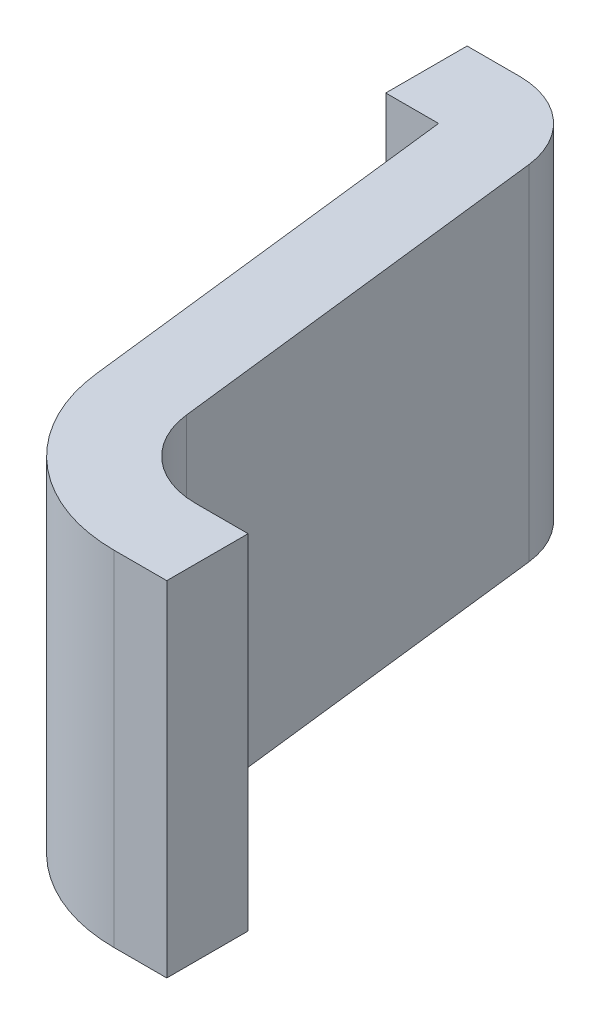
ISO-10303-21;
HEADER;
FILE_DESCRIPTION(('STEP AP214'),'2;1');
FILE_NAME('part.step','',(''),(''),'','','');
FILE_SCHEMA(('AUTOMOTIVE_DESIGN { 1 0 10303 214 1 1 1 1 }'));
ENDSEC;
DATA;
#1=APPLICATION_CONTEXT('core data for automotive mechanical design processes');
#2=APPLICATION_PROTOCOL_DEFINITION('international standard','automotive_design',2000,#1);
#3=PRODUCT_CONTEXT('',#1,'mechanical');
#4=PRODUCT('Part','Part','',(#3));
#5=PRODUCT_RELATED_PRODUCT_CATEGORY('part','',(#4));
#6=PRODUCT_DEFINITION_FORMATION('','',#4);
#7=PRODUCT_DEFINITION_CONTEXT('part definition',#1,'design');
#8=PRODUCT_DEFINITION('design','',#6,#7);
#9=PRODUCT_DEFINITION_SHAPE('','',#8);
#10=(LENGTH_UNIT() NAMED_UNIT(*) SI_UNIT(.MILLI.,.METRE.));
#11=(NAMED_UNIT(*) PLANE_ANGLE_UNIT() SI_UNIT($,.RADIAN.));
#12=(NAMED_UNIT(*) SI_UNIT($,.STERADIAN.) SOLID_ANGLE_UNIT());
#13=UNCERTAINTY_MEASURE_WITH_UNIT(LENGTH_MEASURE(1.E-05),#10,'distance_accuracy_value','');
#14=(GEOMETRIC_REPRESENTATION_CONTEXT(3) GLOBAL_UNCERTAINTY_ASSIGNED_CONTEXT((#13)) GLOBAL_UNIT_ASSIGNED_CONTEXT((#10,
#11,#12)) REPRESENTATION_CONTEXT('',''));
#15=CARTESIAN_POINT('',(0.,0.,0.));
#16=DIRECTION('',(0.,0.,1.));
#17=DIRECTION('',(1.,0.,0.));
#18=AXIS2_PLACEMENT_3D('',#15,#16,#17);
#19=CARTESIAN_POINT('',(-1.765602444701,0.275,0.13));
#20=DIRECTION('',(0.,0.,-1.));
#21=DIRECTION('',(0.,-1.,0.));
#22=AXIS2_PLACEMENT_3D('',#19,#20,#21);
#23=PLANE('',#22);
#24=DIRECTION('',(0.,-1.,0.));
#25=VECTOR('',#24,1.);
#26=CARTESIAN_POINT('',(-1.765602444701,0.275,0.13));
#27=LINE('',#26,#25);
#28=CARTESIAN_POINT('',(-1.765602444701,0.275,0.13));
#29=VERTEX_POINT('',#28);
#30=CARTESIAN_POINT('',(-1.765602444701,-0.275,0.13));
#31=VERTEX_POINT('',#30);
#32=EDGE_CURVE('E11',#29,#31,#27,.T.);
#33=ORIENTED_EDGE('',*,*,#32,.F.);
#34=DIRECTION('',(-1.,0.,0.));
#35=VECTOR('',#34,1.);
#36=CARTESIAN_POINT('',(-1.765602444701,0.275,0.13));
#37=LINE('',#36,#35);
#38=CARTESIAN_POINT('',(-1.85,0.275,0.13));
#39=VERTEX_POINT('',#38);
#40=EDGE_CURVE('E24',#29,#39,#37,.T.);
#41=ORIENTED_EDGE('',*,*,#40,.T.);
#42=DIRECTION('',(0.,-1.,0.));
#43=VECTOR('',#42,1.);
#44=CARTESIAN_POINT('',(-1.85,0.275,0.13));
#45=LINE('',#44,#43);
#46=CARTESIAN_POINT('',(-1.85,-0.275,0.13));
#47=VERTEX_POINT('',#46);
#48=EDGE_CURVE('E187',#39,#47,#45,.T.);
#49=ORIENTED_EDGE('',*,*,#48,.T.);
#50=DIRECTION('',(-1.,0.,0.));
#51=VECTOR('',#50,1.);
#52=CARTESIAN_POINT('',(-1.765602444701,-0.275,0.13));
#53=LINE('',#52,#51);
#54=EDGE_CURVE('E184',#31,#47,#53,.T.);
#55=ORIENTED_EDGE('',*,*,#54,.F.);
#56=EDGE_LOOP('',(#33,#41,#49,#55));
#57=FACE_BOUND('',#56,.T.);
#58=ADVANCED_FACE('F17',(#57),#23,.F.);
#59=CARTESIAN_POINT('',(-1.765602444701,-0.275,0.));
#60=DIRECTION('',(0.,0.,1.));
#61=DIRECTION('',(0.,1.,0.));
#62=AXIS2_PLACEMENT_3D('',#59,#60,#61);
#63=PLANE('',#62);
#64=DIRECTION('',(0.,1.,0.));
#65=VECTOR('',#64,1.);
#66=CARTESIAN_POINT('',(-1.765602444701,-0.8,0.));
#67=LINE('',#66,#65);
#68=CARTESIAN_POINT('',(-1.765602444701,-0.275,0.));
#69=VERTEX_POINT('',#68);
#70=CARTESIAN_POINT('',(-1.765602444701,0.275,0.));
#71=VERTEX_POINT('',#70);
#72=EDGE_CURVE('E182',#69,#71,#67,.T.);
#73=ORIENTED_EDGE('',*,*,#72,.F.);
#74=DIRECTION('',(-1.,0.,0.));
#75=VECTOR('',#74,1.);
#76=CARTESIAN_POINT('',(-1.765602444701,-0.275,0.));
#77=LINE('',#76,#75);
#78=CARTESIAN_POINT('',(-1.85,-0.275,0.));
#79=VERTEX_POINT('',#78);
#80=EDGE_CURVE('E180',#69,#79,#77,.T.);
#81=ORIENTED_EDGE('',*,*,#80,.T.);
#82=DIRECTION('',(0.,1.,0.));
#83=VECTOR('',#82,1.);
#84=CARTESIAN_POINT('',(-1.85,-0.8,0.));
#85=LINE('',#84,#83);
#86=CARTESIAN_POINT('',(-1.85,0.275,0.));
#87=VERTEX_POINT('',#86);
#88=EDGE_CURVE('E178',#79,#87,#85,.T.);
#89=ORIENTED_EDGE('',*,*,#88,.T.);
#90=DIRECTION('',(-1.,0.,0.));
#91=VECTOR('',#90,1.);
#92=CARTESIAN_POINT('',(-1.765602444701,0.275,0.));
#93=LINE('',#92,#91);
#94=EDGE_CURVE('E175',#71,#87,#93,.T.);
#95=ORIENTED_EDGE('',*,*,#94,.F.);
#96=EDGE_LOOP('',(#73,#81,#89,#95));
#97=FACE_BOUND('',#96,.T.);
#98=ADVANCED_FACE('F200',(#97),#63,.F.);
#99=CARTESIAN_POINT('',(-1.85,0.,0.0649999999999996));
#100=DIRECTION('',(1.,0.,0.));
#101=DIRECTION('',(0.,0.,-1.));
#102=AXIS2_PLACEMENT_3D('',#99,#100,#101);
#103=PLANE('',#102);
#104=DIRECTION('',(0.,0.,-1.));
#105=VECTOR('',#104,1.);
#106=CARTESIAN_POINT('',(-1.85,-0.275,0.13));
#107=LINE('',#106,#105);
#108=EDGE_CURVE('E172',#47,#79,#107,.T.);
#109=ORIENTED_EDGE('',*,*,#108,.F.);
#110=ORIENTED_EDGE('',*,*,#48,.F.);
#111=DIRECTION('',(0.,0.,1.));
#112=VECTOR('',#111,1.);
#113=CARTESIAN_POINT('',(-1.85,0.275,0.));
#114=LINE('',#113,#112);
#115=EDGE_CURVE('E169',#87,#39,#114,.T.);
#116=ORIENTED_EDGE('',*,*,#115,.F.);
#117=ORIENTED_EDGE('',*,*,#88,.F.);
#118=EDGE_LOOP('',(#109,#110,#116,#117));
#119=FACE_BOUND('',#118,.T.);
#120=ADVANCED_FACE('F194',(#119),#103,.F.);
#121=CARTESIAN_POINT('',(-1.765602444701,0.,0.129999999999999));
#122=DIRECTION('',(0.,1.,0.));
#123=DIRECTION('',(0.993150604322876,0.,-0.116841247567397));
#124=AXIS2_PLACEMENT_3D('',#121,#122,#123);
#125=CYLINDRICAL_SURFACE('',#124,0.13);
#126=DIRECTION('',(0.,1.,0.));
#127=VECTOR('',#126,1.);
#128=CARTESIAN_POINT('',(-1.636492866139,-0.8,0.114810637816238));
#129=LINE('',#128,#127);
#130=CARTESIAN_POINT('',(-1.636492866139,-0.275,0.114810637816238));
#131=VERTEX_POINT('',#130);
#132=CARTESIAN_POINT('',(-1.636492866139,0.275,0.114810637816238));
#133=VERTEX_POINT('',#132);
#134=EDGE_CURVE('E167',#131,#133,#129,.T.);
#135=ORIENTED_EDGE('',*,*,#134,.F.);
#136=CARTESIAN_POINT('',(-1.765602444701,-0.275,0.129999999999999));
#137=DIRECTION('',(0.,1.,0.));
#138=DIRECTION('',(0.993150604322877,0.,-0.11684124756739));
#139=AXIS2_PLACEMENT_3D('',#136,#137,#138);
#140=CIRCLE('',#139,0.13);
#141=EDGE_CURVE('E164',#131,#69,#140,.T.);
#142=ORIENTED_EDGE('',*,*,#141,.T.);
#143=ORIENTED_EDGE('',*,*,#72,.T.);
#144=CARTESIAN_POINT('',(-1.765602444701,0.275,0.129999999999999));
#145=DIRECTION('',(0.,1.,0.));
#146=DIRECTION('',(0.993150604322877,0.,-0.11684124756739));
#147=AXIS2_PLACEMENT_3D('',#144,#145,#146);
#148=CIRCLE('',#147,0.13);
#149=EDGE_CURVE('E161',#133,#71,#148,.T.);
#150=ORIENTED_EDGE('',*,*,#149,.F.);
#151=EDGE_LOOP('',(#135,#142,#143,#150));
#152=FACE_BOUND('',#151,.T.);
#153=ADVANCED_FACE('F217',(#152),#125,.T.);
#154=CARTESIAN_POINT('',(-1.692616712423,0.275,0.750378724367523));
#155=DIRECTION('',(0.993150604322876,0.,-0.116841247567397));
#156=DIRECTION('',(0.,-1.,0.));
#157=AXIS2_PLACEMENT_3D('',#154,#155,#156);
#158=PLANE('',#157);
#159=DIRECTION('',(0.,-1.,0.));
#160=VECTOR('',#159,1.);
#161=CARTESIAN_POINT('',(-1.692616712423,0.275,0.750378724367523));
#162=LINE('',#161,#160);
#163=CARTESIAN_POINT('',(-1.692616712423,0.275,0.750378724367523));
#164=VERTEX_POINT('',#163);
#165=CARTESIAN_POINT('',(-1.692616712423,-0.275,0.750378724367523));
#166=VERTEX_POINT('',#165);
#167=EDGE_CURVE('E159',#164,#166,#162,.T.);
#168=ORIENTED_EDGE('',*,*,#167,.F.);
#169=DIRECTION('',(-0.116841247567398,0.,-0.993150604322876));
#170=VECTOR('',#169,1.);
#171=CARTESIAN_POINT('',(-1.692616712423,0.275,0.750378724367523));
#172=LINE('',#171,#170);
#173=EDGE_CURVE('E157',#164,#29,#172,.T.);
#174=ORIENTED_EDGE('',*,*,#173,.T.);
#175=ORIENTED_EDGE('',*,*,#32,.T.);
#176=DIRECTION('',(-0.116841247567398,0.,-0.993150604322876));
#177=VECTOR('',#176,1.);
#178=CARTESIAN_POINT('',(-1.692616712423,-0.275,0.750378724367523));
#179=LINE('',#178,#177);
#180=EDGE_CURVE('E154',#166,#31,#179,.T.);
#181=ORIENTED_EDGE('',*,*,#180,.F.);
#182=EDGE_LOOP('',(#168,#174,#175,#181));
#183=FACE_BOUND('',#182,.T.);
#184=ADVANCED_FACE('F204',(#183),#158,.F.);
#185=CARTESIAN_POINT('',(-1.563507133861,-0.275,0.735189362183763));
#186=DIRECTION('',(-0.993150604322876,0.,0.116841247567397));
#187=DIRECTION('',(0.,1.,0.));
#188=AXIS2_PLACEMENT_3D('',#185,#186,#187);
#189=PLANE('',#188);
#190=DIRECTION('',(0.,1.,0.));
#191=VECTOR('',#190,1.);
#192=CARTESIAN_POINT('',(-1.563507133861,-0.8,0.735189362183763));
#193=LINE('',#192,#191);
#194=CARTESIAN_POINT('',(-1.563507133861,-0.275,0.735189362183763));
#195=VERTEX_POINT('',#194);
#196=CARTESIAN_POINT('',(-1.563507133861,0.275,0.735189362183763));
#197=VERTEX_POINT('',#196);
#198=EDGE_CURVE('E152',#195,#197,#193,.T.);
#199=ORIENTED_EDGE('',*,*,#198,.F.);
#200=DIRECTION('',(-0.116841247567398,0.,-0.993150604322876));
#201=VECTOR('',#200,1.);
#202=CARTESIAN_POINT('',(-1.563507133861,-0.275,0.735189362183763));
#203=LINE('',#202,#201);
#204=EDGE_CURVE('E149',#195,#131,#203,.T.);
#205=ORIENTED_EDGE('',*,*,#204,.T.);
#206=ORIENTED_EDGE('',*,*,#134,.T.);
#207=DIRECTION('',(-0.116841247567398,0.,-0.993150604322876));
#208=VECTOR('',#207,1.);
#209=CARTESIAN_POINT('',(-1.563507133861,0.275,0.735189362183763));
#210=LINE('',#209,#208);
#211=EDGE_CURVE('E146',#197,#133,#210,.T.);
#212=ORIENTED_EDGE('',*,*,#211,.F.);
#213=EDGE_LOOP('',(#199,#205,#206,#212));
#214=FACE_BOUND('',#213,.T.);
#215=ADVANCED_FACE('F215',(#214),#189,.F.);
#216=CARTESIAN_POINT('',(-1.434397555299,0.,0.720000000000001));
#217=DIRECTION('',(0.,-1.,0.));
#218=DIRECTION('',(0.993150604322876,0.,-0.116841247567397));
#219=AXIS2_PLACEMENT_3D('',#216,#217,#218);
#220=CYLINDRICAL_SURFACE('',#219,0.259999999999999);
#221=DIRECTION('',(0.,-1.,0.));
#222=VECTOR('',#221,1.);
#223=CARTESIAN_POINT('',(-1.434397555299,0.275,0.979999999999999));
#224=LINE('',#223,#222);
#225=CARTESIAN_POINT('',(-1.434397555299,0.275,0.979999999999999));
#226=VERTEX_POINT('',#225);
#227=CARTESIAN_POINT('',(-1.434397555299,-0.275,0.979999999999999));
#228=VERTEX_POINT('',#227);
#229=EDGE_CURVE('E144',#226,#228,#224,.T.);
#230=ORIENTED_EDGE('',*,*,#229,.F.);
#231=CARTESIAN_POINT('',(-1.434397555299,0.275,0.720000000000001));
#232=DIRECTION('',(0.,-1.,0.));
#233=DIRECTION('',(0.,0.,1.));
#234=AXIS2_PLACEMENT_3D('',#231,#232,#233);
#235=CIRCLE('',#234,0.259999999999999);
#236=EDGE_CURVE('E141',#226,#164,#235,.T.);
#237=ORIENTED_EDGE('',*,*,#236,.T.);
#238=ORIENTED_EDGE('',*,*,#167,.T.);
#239=CARTESIAN_POINT('',(-1.434397555299,-0.275,0.720000000000001));
#240=DIRECTION('',(0.,-1.,0.));
#241=DIRECTION('',(0.,0.,1.));
#242=AXIS2_PLACEMENT_3D('',#239,#240,#241);
#243=CIRCLE('',#242,0.259999999999999);
#244=EDGE_CURVE('E138',#228,#166,#243,.T.);
#245=ORIENTED_EDGE('',*,*,#244,.F.);
#246=EDGE_LOOP('',(#230,#237,#238,#245));
#247=FACE_BOUND('',#246,.T.);
#248=ADVANCED_FACE('F208',(#247),#220,.T.);
#249=CARTESIAN_POINT('',(-1.434397555299,0.,0.720000000000001));
#250=DIRECTION('',(0.,-1.,0.));
#251=DIRECTION('',(0.993150604322876,0.,-0.116841247567397));
#252=AXIS2_PLACEMENT_3D('',#249,#250,#251);
#253=CYLINDRICAL_SURFACE('',#252,0.13);
#254=DIRECTION('',(0.,1.,0.));
#255=VECTOR('',#254,1.);
#256=CARTESIAN_POINT('',(-1.434397555299,-0.8,0.850000000000001));
#257=LINE('',#256,#255);
#258=CARTESIAN_POINT('',(-1.434397555299,-0.275,0.850000000000001));
#259=VERTEX_POINT('',#258);
#260=CARTESIAN_POINT('',(-1.434397555299,0.275,0.850000000000001));
#261=VERTEX_POINT('',#260);
#262=EDGE_CURVE('E136',#259,#261,#257,.T.);
#263=ORIENTED_EDGE('',*,*,#262,.F.);
#264=CARTESIAN_POINT('',(-1.434397555299,-0.275,0.720000000000001));
#265=DIRECTION('',(0.,-1.,0.));
#266=DIRECTION('',(0.,0.,1.));
#267=AXIS2_PLACEMENT_3D('',#264,#265,#266);
#268=CIRCLE('',#267,0.13);
#269=EDGE_CURVE('E115',#259,#195,#268,.T.);
#270=ORIENTED_EDGE('',*,*,#269,.T.);
#271=ORIENTED_EDGE('',*,*,#198,.T.);
#272=CARTESIAN_POINT('',(-1.434397555299,0.275,0.720000000000001));
#273=DIRECTION('',(0.,-1.,0.));
#274=DIRECTION('',(0.,0.,1.));
#275=AXIS2_PLACEMENT_3D('',#272,#273,#274);
#276=CIRCLE('',#275,0.13);
#277=EDGE_CURVE('E132',#261,#197,#276,.T.);
#278=ORIENTED_EDGE('',*,*,#277,.F.);
#279=EDGE_LOOP('',(#263,#270,#271,#278));
#280=FACE_BOUND('',#279,.T.);
#281=ADVANCED_FACE('F213',(#280),#253,.F.);
#282=CARTESIAN_POINT('',(-1.35,0.275,0.979999999999999));
#283=DIRECTION('',(0.,0.,-1.));
#284=DIRECTION('',(0.,-1.,0.));
#285=AXIS2_PLACEMENT_3D('',#282,#283,#284);
#286=PLANE('',#285);
#287=DIRECTION('',(0.,-1.,0.));
#288=VECTOR('',#287,1.);
#289=CARTESIAN_POINT('',(-1.35,0.275,0.979999999999999));
#290=LINE('',#289,#288);
#291=CARTESIAN_POINT('',(-1.35,0.275,0.979999999999999));
#292=VERTEX_POINT('',#291);
#293=CARTESIAN_POINT('',(-1.35,-0.275,0.979999999999999));
#294=VERTEX_POINT('',#293);
#295=EDGE_CURVE('E119',#292,#294,#290,.T.);
#296=ORIENTED_EDGE('',*,*,#295,.F.);
#297=DIRECTION('',(-1.,0.,0.));
#298=VECTOR('',#297,1.);
#299=CARTESIAN_POINT('',(-1.35,0.275,0.979999999999999));
#300=LINE('',#299,#298);
#301=EDGE_CURVE('E128',#292,#226,#300,.T.);
#302=ORIENTED_EDGE('',*,*,#301,.T.);
#303=ORIENTED_EDGE('',*,*,#229,.T.);
#304=DIRECTION('',(-1.,0.,0.));
#305=VECTOR('',#304,1.);
#306=CARTESIAN_POINT('',(-1.35,-0.275,0.979999999999999));
#307=LINE('',#306,#305);
#308=EDGE_CURVE('E126',#294,#228,#307,.T.);
#309=ORIENTED_EDGE('',*,*,#308,.F.);
#310=EDGE_LOOP('',(#296,#302,#303,#309));
#311=FACE_BOUND('',#310,.T.);
#312=ADVANCED_FACE('F210',(#311),#286,.F.);
#313=CARTESIAN_POINT('',(-1.35,0.275,0.850000000000001));
#314=DIRECTION('',(0.,-1.,0.));
#315=DIRECTION('',(0.,0.,1.));
#316=AXIS2_PLACEMENT_3D('',#313,#314,#315);
#317=PLANE('',#316);
#318=DIRECTION('',(0.,0.,1.));
#319=VECTOR('',#318,1.);
#320=CARTESIAN_POINT('',(-1.35,0.275,0.850000000000001));
#321=LINE('',#320,#319);
#322=CARTESIAN_POINT('',(-1.35,0.275,0.850000000000001));
#323=VERTEX_POINT('',#322);
#324=EDGE_CURVE('E124',#323,#292,#321,.T.);
#325=ORIENTED_EDGE('',*,*,#324,.F.);
#326=DIRECTION('',(-1.,0.,0.));
#327=VECTOR('',#326,1.);
#328=CARTESIAN_POINT('',(-1.35,0.275,0.850000000000001));
#329=LINE('',#328,#327);
#330=EDGE_CURVE('E103',#323,#261,#329,.T.);
#331=ORIENTED_EDGE('',*,*,#330,.T.);
#332=ORIENTED_EDGE('',*,*,#277,.T.);
#333=ORIENTED_EDGE('',*,*,#211,.T.);
#334=ORIENTED_EDGE('',*,*,#149,.T.);
#335=ORIENTED_EDGE('',*,*,#94,.T.);
#336=ORIENTED_EDGE('',*,*,#115,.T.);
#337=ORIENTED_EDGE('',*,*,#40,.F.);
#338=ORIENTED_EDGE('',*,*,#173,.F.);
#339=ORIENTED_EDGE('',*,*,#236,.F.);
#340=ORIENTED_EDGE('',*,*,#301,.F.);
#341=EDGE_LOOP('',(#325,#331,#332,#333,#334,#335,#336,#337,#338,#339,#340));
#342=FACE_BOUND('',#341,.T.);
#343=ADVANCED_FACE('F196',(#342),#317,.F.);
#344=CARTESIAN_POINT('',(-1.35,-0.275,0.850000000000001));
#345=DIRECTION('',(0.,0.,1.));
#346=DIRECTION('',(0.,1.,0.));
#347=AXIS2_PLACEMENT_3D('',#344,#345,#346);
#348=PLANE('',#347);
#349=DIRECTION('',(0.,1.,0.));
#350=VECTOR('',#349,1.);
#351=CARTESIAN_POINT('',(-1.35,-0.8,0.850000000000001));
#352=LINE('',#351,#350);
#353=CARTESIAN_POINT('',(-1.35,-0.275,0.850000000000001));
#354=VERTEX_POINT('',#353);
#355=EDGE_CURVE('E97',#354,#323,#352,.T.);
#356=ORIENTED_EDGE('',*,*,#355,.F.);
#357=DIRECTION('',(-1.,0.,0.));
#358=VECTOR('',#357,1.);
#359=CARTESIAN_POINT('',(-1.35,-0.275,0.850000000000001));
#360=LINE('',#359,#358);
#361=EDGE_CURVE('E101',#354,#259,#360,.T.);
#362=ORIENTED_EDGE('',*,*,#361,.T.);
#363=ORIENTED_EDGE('',*,*,#262,.T.);
#364=ORIENTED_EDGE('',*,*,#330,.F.);
#365=EDGE_LOOP('',(#356,#362,#363,#364));
#366=FACE_BOUND('',#365,.T.);
#367=ADVANCED_FACE('F99',(#366),#348,.F.);
#368=CARTESIAN_POINT('',(-1.35,-0.275,0.979999999999999));
#369=DIRECTION('',(0.,1.,0.));
#370=DIRECTION('',(0.,0.,-1.));
#371=AXIS2_PLACEMENT_3D('',#368,#369,#370);
#372=PLANE('',#371);
#373=DIRECTION('',(0.,0.,-1.));
#374=VECTOR('',#373,1.);
#375=CARTESIAN_POINT('',(-1.35,-0.275,0.979999999999999));
#376=LINE('',#375,#374);
#377=EDGE_CURVE('E112',#294,#354,#376,.T.);
#378=ORIENTED_EDGE('',*,*,#377,.F.);
#379=ORIENTED_EDGE('',*,*,#308,.T.);
#380=ORIENTED_EDGE('',*,*,#244,.T.);
#381=ORIENTED_EDGE('',*,*,#180,.T.);
#382=ORIENTED_EDGE('',*,*,#54,.T.);
#383=ORIENTED_EDGE('',*,*,#108,.T.);
#384=ORIENTED_EDGE('',*,*,#80,.F.);
#385=ORIENTED_EDGE('',*,*,#141,.F.);
#386=ORIENTED_EDGE('',*,*,#204,.F.);
#387=ORIENTED_EDGE('',*,*,#269,.F.);
#388=ORIENTED_EDGE('',*,*,#361,.F.);
#389=EDGE_LOOP('',(#378,#379,#380,#381,#382,#383,#384,#385,#386,#387,#388));
#390=FACE_BOUND('',#389,.T.);
#391=ADVANCED_FACE('F110',(#390),#372,.F.);
#392=CARTESIAN_POINT('',(-1.35,0.,0.915));
#393=DIRECTION('',(1.,0.,0.));
#394=DIRECTION('',(0.,0.,-1.));
#395=AXIS2_PLACEMENT_3D('',#392,#393,#394);
#396=PLANE('',#395);
#397=ORIENTED_EDGE('',*,*,#377,.T.);
#398=ORIENTED_EDGE('',*,*,#355,.T.);
#399=ORIENTED_EDGE('',*,*,#324,.T.);
#400=ORIENTED_EDGE('',*,*,#295,.T.);
#401=EDGE_LOOP('',(#397,#398,#399,#400));
#402=FACE_BOUND('',#401,.T.);
#403=ADVANCED_FACE('F118',(#402),#396,.T.);
#404=CLOSED_SHELL('',(#58,#98,#120,#153,#184,#215,#248,#281,#312,#343,#367,#391,#403));
#405=MANIFOLD_SOLID_BREP('B1',#404);
#406=ADVANCED_BREP_SHAPE_REPRESENTATION('',(#18,#405),#14);
#407=SHAPE_DEFINITION_REPRESENTATION(#9,#406);
ENDSEC;
END-ISO-10303-21;
